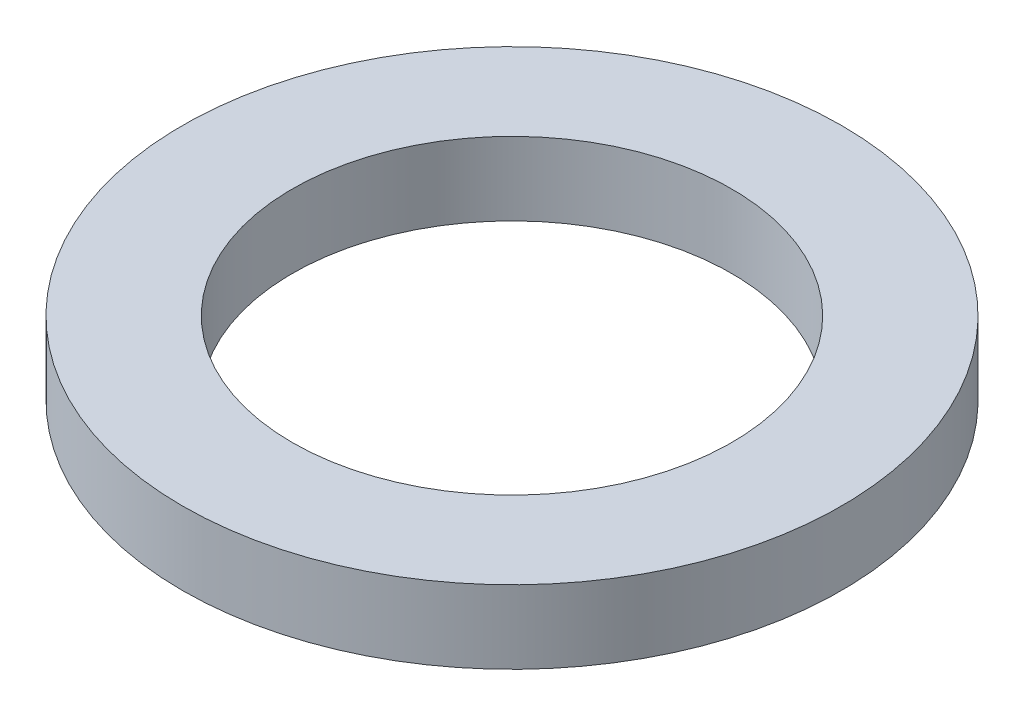
ISO-10303-21;
HEADER;
FILE_DESCRIPTION(('STEP AP214'),'2;1');
FILE_NAME('part.step','',(''),(''),'','','');
FILE_SCHEMA(('AUTOMOTIVE_DESIGN { 1 0 10303 214 1 1 1 1 }'));
ENDSEC;
DATA;
#1=APPLICATION_CONTEXT('core data for automotive mechanical design processes');
#2=APPLICATION_PROTOCOL_DEFINITION('international standard','automotive_design',2000,#1);
#3=PRODUCT_CONTEXT('',#1,'mechanical');
#4=PRODUCT('Part','Part','',(#3));
#5=PRODUCT_RELATED_PRODUCT_CATEGORY('part','',(#4));
#6=PRODUCT_DEFINITION_FORMATION('','',#4);
#7=PRODUCT_DEFINITION_CONTEXT('part definition',#1,'design');
#8=PRODUCT_DEFINITION('design','',#6,#7);
#9=PRODUCT_DEFINITION_SHAPE('','',#8);
#10=(LENGTH_UNIT() NAMED_UNIT(*) SI_UNIT(.MILLI.,.METRE.));
#11=(NAMED_UNIT(*) PLANE_ANGLE_UNIT() SI_UNIT($,.RADIAN.));
#12=(NAMED_UNIT(*) SI_UNIT($,.STERADIAN.) SOLID_ANGLE_UNIT());
#13=UNCERTAINTY_MEASURE_WITH_UNIT(LENGTH_MEASURE(1.E-05),#10,'distance_accuracy_value','');
#14=(GEOMETRIC_REPRESENTATION_CONTEXT(3) GLOBAL_UNCERTAINTY_ASSIGNED_CONTEXT((#13)) GLOBAL_UNIT_ASSIGNED_CONTEXT((#10,
#11,#12)) REPRESENTATION_CONTEXT('',''));
#15=CARTESIAN_POINT('',(0.,0.,0.));
#16=DIRECTION('',(0.,0.,1.));
#17=DIRECTION('',(1.,0.,0.));
#18=AXIS2_PLACEMENT_3D('',#15,#16,#17);
#19=CARTESIAN_POINT('',(0.,5.,0.));
#20=DIRECTION('',(0.,1.,0.));
#21=DIRECTION('',(0.,0.,1.));
#22=AXIS2_PLACEMENT_3D('',#19,#20,#21);
#23=PLANE('',#22);
#24=CARTESIAN_POINT('',(0.,5.,0.));
#25=DIRECTION('',(0.,1.,0.));
#26=DIRECTION('',(0.,0.,1.));
#27=AXIS2_PLACEMENT_3D('',#24,#25,#26);
#28=CIRCLE('',#27,22.5);
#29=CARTESIAN_POINT('',(0.,5.,22.5));
#30=VERTEX_POINT('',#29);
#31=EDGE_CURVE('E10',#30,#30,#28,.T.);
#32=ORIENTED_EDGE('',*,*,#31,.T.);
#33=EDGE_LOOP('',(#32));
#34=FACE_BOUND('',#33,.T.);
#35=CARTESIAN_POINT('',(0.,5.,0.));
#36=DIRECTION('',(0.,1.,0.));
#37=DIRECTION('',(0.,0.,1.));
#38=AXIS2_PLACEMENT_3D('',#35,#36,#37);
#39=CIRCLE('',#38,15.);
#40=CARTESIAN_POINT('',(0.,5.,15.));
#41=VERTEX_POINT('',#40);
#42=EDGE_CURVE('E46',#41,#41,#39,.T.);
#43=ORIENTED_EDGE('',*,*,#42,.F.);
#44=EDGE_LOOP('',(#43));
#45=FACE_BOUND('',#44,.T.);
#46=ADVANCED_FACE('F35',(#34,#45),#23,.T.);
#47=CARTESIAN_POINT('',(0.,0.,0.));
#48=DIRECTION('',(0.,1.,0.));
#49=DIRECTION('',(0.,0.,1.));
#50=AXIS2_PLACEMENT_3D('',#47,#48,#49);
#51=PLANE('',#50);
#52=CARTESIAN_POINT('',(0.,0.,0.));
#53=DIRECTION('',(0.,1.,0.));
#54=DIRECTION('',(0.,0.,1.));
#55=AXIS2_PLACEMENT_3D('',#52,#53,#54);
#56=CIRCLE('',#55,22.5);
#57=CARTESIAN_POINT('',(0.,0.,22.5));
#58=VERTEX_POINT('',#57);
#59=EDGE_CURVE('E39',#58,#58,#56,.T.);
#60=ORIENTED_EDGE('',*,*,#59,.F.);
#61=EDGE_LOOP('',(#60));
#62=FACE_BOUND('',#61,.T.);
#63=CARTESIAN_POINT('',(0.,0.,0.));
#64=DIRECTION('',(0.,1.,0.));
#65=DIRECTION('',(0.,0.,1.));
#66=AXIS2_PLACEMENT_3D('',#63,#64,#65);
#67=CIRCLE('',#66,15.);
#68=CARTESIAN_POINT('',(0.,0.,15.));
#69=VERTEX_POINT('',#68);
#70=EDGE_CURVE('E48',#69,#69,#67,.T.);
#71=ORIENTED_EDGE('',*,*,#70,.T.);
#72=EDGE_LOOP('',(#71));
#73=FACE_BOUND('',#72,.T.);
#74=ADVANCED_FACE('F58',(#62,#73),#51,.F.);
#75=CARTESIAN_POINT('',(0.,5.,0.));
#76=DIRECTION('',(0.,-1.,0.));
#77=DIRECTION('',(0.,0.,-1.));
#78=AXIS2_PLACEMENT_3D('',#75,#76,#77);
#79=CYLINDRICAL_SURFACE('',#78,22.5);
#80=ORIENTED_EDGE('',*,*,#31,.F.);
#81=EDGE_LOOP('',(#80));
#82=FACE_BOUND('',#81,.T.);
#83=ORIENTED_EDGE('',*,*,#59,.T.);
#84=EDGE_LOOP('',(#83));
#85=FACE_BOUND('',#84,.T.);
#86=ADVANCED_FACE('F37',(#82,#85),#79,.T.);
#87=CARTESIAN_POINT('',(0.,5.,0.));
#88=DIRECTION('',(0.,-1.,0.));
#89=DIRECTION('',(0.,0.,-1.));
#90=AXIS2_PLACEMENT_3D('',#87,#88,#89);
#91=CYLINDRICAL_SURFACE('',#90,15.);
#92=ORIENTED_EDGE('',*,*,#42,.T.);
#93=EDGE_LOOP('',(#92));
#94=FACE_BOUND('',#93,.T.);
#95=ORIENTED_EDGE('',*,*,#70,.F.);
#96=EDGE_LOOP('',(#95));
#97=FACE_BOUND('',#96,.T.);
#98=ADVANCED_FACE('F54',(#94,#97),#91,.F.);
#99=CLOSED_SHELL('',(#46,#74,#86,#98));
#100=MANIFOLD_SOLID_BREP('B2',#99);
#101=ADVANCED_BREP_SHAPE_REPRESENTATION('',(#18,#100),#14);
#102=SHAPE_DEFINITION_REPRESENTATION(#9,#101);
ENDSEC;
END-ISO-10303-21;
